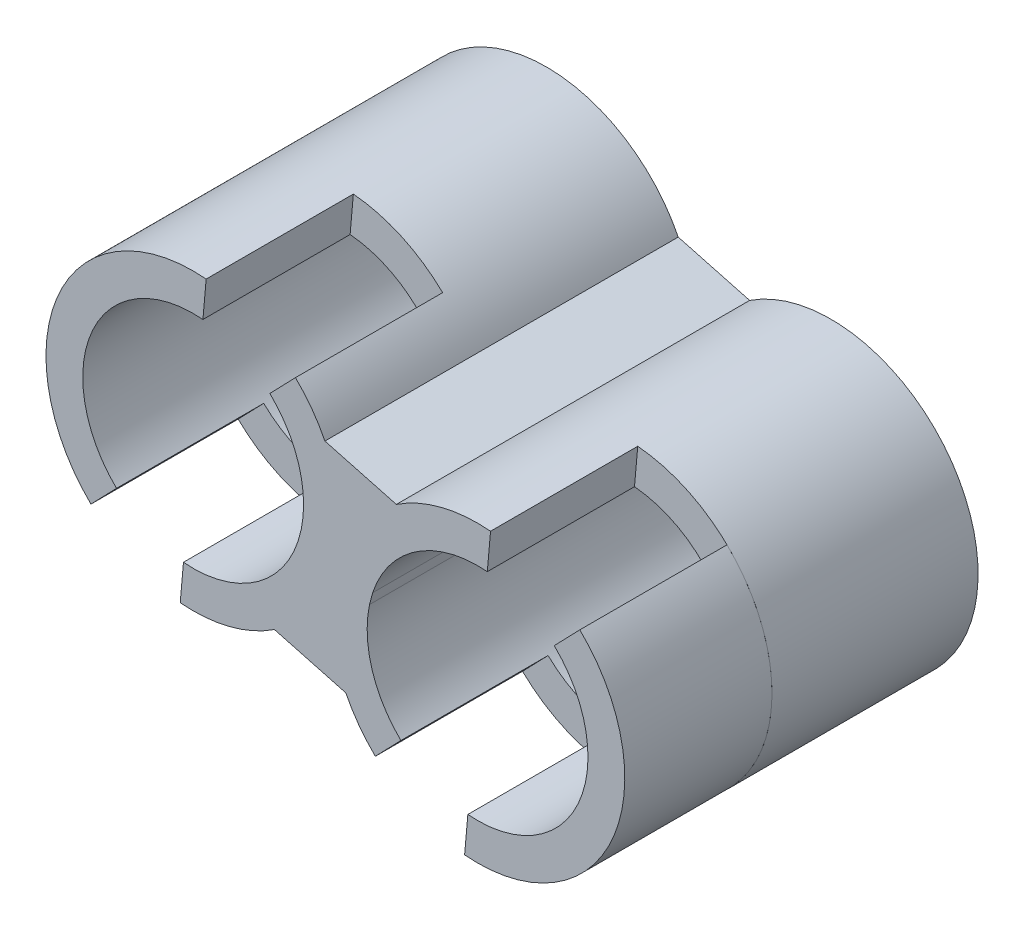
ISO-10303-21;
HEADER;
FILE_DESCRIPTION(('STEP AP214'),'2;1');
FILE_NAME('part.step','',(''),(''),'','','');
FILE_SCHEMA(('AUTOMOTIVE_DESIGN { 1 0 10303 214 1 1 1 1 }'));
ENDSEC;
DATA;
#1=APPLICATION_CONTEXT('core data for automotive mechanical design processes');
#2=APPLICATION_PROTOCOL_DEFINITION('international standard','automotive_design',2000,#1);
#3=PRODUCT_CONTEXT('',#1,'mechanical');
#4=PRODUCT('Part','Part','',(#3));
#5=PRODUCT_RELATED_PRODUCT_CATEGORY('part','',(#4));
#6=PRODUCT_DEFINITION_FORMATION('','',#4);
#7=PRODUCT_DEFINITION_CONTEXT('part definition',#1,'design');
#8=PRODUCT_DEFINITION('design','',#6,#7);
#9=PRODUCT_DEFINITION_SHAPE('','',#8);
#10=(LENGTH_UNIT() NAMED_UNIT(*) SI_UNIT(.MILLI.,.METRE.));
#11=(NAMED_UNIT(*) PLANE_ANGLE_UNIT() SI_UNIT($,.RADIAN.));
#12=(NAMED_UNIT(*) SI_UNIT($,.STERADIAN.) SOLID_ANGLE_UNIT());
#13=UNCERTAINTY_MEASURE_WITH_UNIT(LENGTH_MEASURE(1.E-05),#10,'distance_accuracy_value','');
#14=(GEOMETRIC_REPRESENTATION_CONTEXT(3) GLOBAL_UNCERTAINTY_ASSIGNED_CONTEXT((#13)) GLOBAL_UNIT_ASSIGNED_CONTEXT((#10,
#11,#12)) REPRESENTATION_CONTEXT('',''));
#15=CARTESIAN_POINT('',(0.,0.,0.));
#16=DIRECTION('',(0.,0.,1.));
#17=DIRECTION('',(1.,0.,0.));
#18=AXIS2_PLACEMENT_3D('',#15,#16,#17);
#19=CARTESIAN_POINT('',(19.3185165257814,-5.17638090205016,24.));
#20=DIRECTION('',(0.,0.,-1.));
#21=DIRECTION('',(-1.,0.,0.));
#22=AXIS2_PLACEMENT_3D('',#19,#20,#21);
#23=CYLINDRICAL_SURFACE('',#22,7.5);
#24=CARTESIAN_POINT('',(19.3185165257814,-5.17638090205016,14.));
#25=DIRECTION('',(0.,0.,1.));
#26=DIRECTION('',(1.,0.,0.));
#27=AXIS2_PLACEMENT_3D('',#24,#25,#26);
#28=CIRCLE('',#27,7.5);
#29=CARTESIAN_POINT('',(18.6579738156018,-12.6472364974976,14.));
#30=VERTEX_POINT('',#29);
#31=CARTESIAN_POINT('',(24.5279987695268,0.219107468069976,14.));
#32=VERTEX_POINT('',#31);
#33=EDGE_CURVE('E186',#30,#32,#28,.T.);
#34=ORIENTED_EDGE('',*,*,#33,.F.);
#35=DIRECTION('',(0.,0.,-1.));
#36=VECTOR('',#35,1.);
#37=CARTESIAN_POINT('',(18.6579738156018,-12.6472364974976,24.));
#38=LINE('',#37,#36);
#39=CARTESIAN_POINT('',(18.6579738156018,-12.6472364974976,24.));
#40=VERTEX_POINT('',#39);
#41=EDGE_CURVE('E13',#40,#30,#38,.T.);
#42=ORIENTED_EDGE('',*,*,#41,.F.);
#43=CARTESIAN_POINT('',(19.3185165257814,-5.17638090205016,24.));
#44=DIRECTION('',(0.,0.,1.));
#45=DIRECTION('',(1.,0.,0.));
#46=AXIS2_PLACEMENT_3D('',#43,#44,#45);
#47=CIRCLE('',#46,7.5);
#48=CARTESIAN_POINT('',(24.5279987695268,0.219107468069976,24.));
#49=VERTEX_POINT('',#48);
#50=EDGE_CURVE('E171',#40,#49,#47,.T.);
#51=ORIENTED_EDGE('',*,*,#50,.T.);
#52=DIRECTION('',(0.,0.,-1.));
#53=VECTOR('',#52,1.);
#54=CARTESIAN_POINT('',(24.5279987695268,0.219107468069976,24.));
#55=LINE('',#54,#53);
#56=EDGE_CURVE('E139',#49,#32,#55,.T.);
#57=ORIENTED_EDGE('',*,*,#56,.T.);
#58=EDGE_LOOP('',(#34,#42,#51,#57));
#59=FACE_BOUND('',#58,.T.);
#60=ADVANCED_FACE('F123',(#59),#23,.F.);
#61=CARTESIAN_POINT('',(19.6227923130935,-1.73496760179407,24.));
#62=DIRECTION('',(0.996114079392994,-0.0880723613572872,0.));
#63=DIRECTION('',(0.0880723613572872,0.996114079392994,0.));
#64=AXIS2_PLACEMENT_3D('',#61,#62,#63);
#65=PLANE('',#64);
#66=DIRECTION('',(-0.0880723613572873,-0.996114079392994,0.));
#67=VECTOR('',#66,1.);
#68=CARTESIAN_POINT('',(19.6227923130935,-1.73496760179407,14.));
#69=LINE('',#68,#67);
#70=CARTESIAN_POINT('',(18.4377929122086,-15.1375216959801,14.));
#71=VERTEX_POINT('',#70);
#72=EDGE_CURVE('E177',#30,#71,#69,.T.);
#73=ORIENTED_EDGE('',*,*,#72,.T.);
#74=DIRECTION('',(0.,0.,-1.));
#75=VECTOR('',#74,1.);
#76=CARTESIAN_POINT('',(18.4377929122086,-15.1375216959801,24.));
#77=LINE('',#76,#75);
#78=CARTESIAN_POINT('',(18.4377929122086,-15.1375216959801,24.));
#79=VERTEX_POINT('',#78);
#80=EDGE_CURVE('E131',#79,#71,#77,.T.);
#81=ORIENTED_EDGE('',*,*,#80,.F.);
#82=DIRECTION('',(-0.0880723613572873,-0.996114079392994,0.));
#83=VECTOR('',#82,1.);
#84=CARTESIAN_POINT('',(19.6227923130935,-1.73496760179407,24.));
#85=LINE('',#84,#83);
#86=EDGE_CURVE('E165',#40,#79,#85,.T.);
#87=ORIENTED_EDGE('',*,*,#86,.F.);
#88=ORIENTED_EDGE('',*,*,#41,.T.);
#89=EDGE_LOOP('',(#73,#81,#87,#88));
#90=FACE_BOUND('',#89,.T.);
#91=ADVANCED_FACE('F175',(#90),#65,.F.);
#92=CARTESIAN_POINT('',(19.3185165257814,-5.17638090205016,24.));
#93=DIRECTION('',(0.,0.,-1.));
#94=DIRECTION('',(-1.,0.,0.));
#95=AXIS2_PLACEMENT_3D('',#92,#93,#94);
#96=CYLINDRICAL_SURFACE('',#95,10.);
#97=CARTESIAN_POINT('',(19.3185165257814,-5.17638090205016,14.));
#98=DIRECTION('',(0.,0.,1.));
#99=DIRECTION('',(1.,0.,0.));
#100=AXIS2_PLACEMENT_3D('',#97,#98,#99);
#101=CIRCLE('',#100,10.);
#102=CARTESIAN_POINT('',(26.2644928507753,2.01760359144336,14.));
#103=VERTEX_POINT('',#102);
#104=EDGE_CURVE('E189',#71,#103,#101,.T.);
#105=ORIENTED_EDGE('',*,*,#104,.T.);
#106=DIRECTION('',(0.,0.,-1.));
#107=VECTOR('',#106,1.);
#108=CARTESIAN_POINT('',(26.2644928507753,2.01760359144336,24.));
#109=LINE('',#108,#107);
#110=CARTESIAN_POINT('',(26.2644928507753,2.01760359144336,24.));
#111=VERTEX_POINT('',#110);
#112=EDGE_CURVE('E153',#111,#103,#109,.T.);
#113=ORIENTED_EDGE('',*,*,#112,.F.);
#114=CARTESIAN_POINT('',(19.3185165257814,-5.17638090205016,24.));
#115=DIRECTION('',(0.,0.,1.));
#116=DIRECTION('',(1.,0.,0.));
#117=AXIS2_PLACEMENT_3D('',#114,#115,#116);
#118=CIRCLE('',#117,10.);
#119=EDGE_CURVE('E170',#79,#111,#118,.T.);
#120=ORIENTED_EDGE('',*,*,#119,.F.);
#121=ORIENTED_EDGE('',*,*,#80,.T.);
#122=EDGE_LOOP('',(#105,#113,#120,#121));
#123=FACE_BOUND('',#122,.T.);
#124=ADVANCED_FACE('F180',(#123),#96,.T.);
#125=CARTESIAN_POINT('',(12.5845901278236,-12.1507441622472,24.));
#126=DIRECTION('',(-0.719398449349352,0.694597632499383,0.));
#127=DIRECTION('',(-0.694597632499383,-0.719398449349352,0.));
#128=AXIS2_PLACEMENT_3D('',#125,#126,#127);
#129=PLANE('',#128);
#130=DIRECTION('',(0.694597632499383,0.719398449349352,0.));
#131=VECTOR('',#130,1.);
#132=CARTESIAN_POINT('',(12.5845901278236,-12.1507441622472,14.));
#133=LINE('',#132,#131);
#134=EDGE_CURVE('E191',#32,#103,#133,.T.);
#135=ORIENTED_EDGE('',*,*,#134,.F.);
#136=ORIENTED_EDGE('',*,*,#56,.F.);
#137=DIRECTION('',(0.694597632499383,0.719398449349352,0.));
#138=VECTOR('',#137,1.);
#139=CARTESIAN_POINT('',(12.5845901278236,-12.1507441622472,24.));
#140=LINE('',#139,#138);
#141=EDGE_CURVE('E181',#49,#111,#140,.T.);
#142=ORIENTED_EDGE('',*,*,#141,.T.);
#143=ORIENTED_EDGE('',*,*,#112,.T.);
#144=EDGE_LOOP('',(#135,#136,#142,#143));
#145=FACE_BOUND('',#144,.T.);
#146=ADVANCED_FACE('F196',(#145),#129,.T.);
#147=CARTESIAN_POINT('',(0.,0.,24.));
#148=DIRECTION('',(0.,0.,1.));
#149=DIRECTION('',(1.,0.,0.));
#150=AXIS2_PLACEMENT_3D('',#147,#148,#149);
#151=PLANE('',#150);
#152=ORIENTED_EDGE('',*,*,#50,.F.);
#153=ORIENTED_EDGE('',*,*,#86,.T.);
#154=ORIENTED_EDGE('',*,*,#119,.T.);
#155=ORIENTED_EDGE('',*,*,#141,.F.);
#156=EDGE_LOOP('',(#152,#153,#154,#155));
#157=FACE_BOUND('',#156,.T.);
#158=ADVANCED_FACE('F167',(#157),#151,.T.);
#159=CARTESIAN_POINT('',(0.,0.,14.));
#160=DIRECTION('',(0.,0.,1.));
#161=DIRECTION('',(1.,0.,0.));
#162=AXIS2_PLACEMENT_3D('',#159,#160,#161);
#163=PLANE('',#162);
#164=ORIENTED_EDGE('',*,*,#33,.T.);
#165=ORIENTED_EDGE('',*,*,#134,.T.);
#166=ORIENTED_EDGE('',*,*,#104,.F.);
#167=ORIENTED_EDGE('',*,*,#72,.F.);
#168=EDGE_LOOP('',(#164,#165,#166,#167));
#169=FACE_BOUND('',#168,.T.);
#170=ADVANCED_FACE('F203',(#169),#163,.F.);
#171=CLOSED_SHELL('',(#60,#91,#124,#146,#158,#170));
#172=MANIFOLD_SOLID_BREP('B2',#171);
#173=CARTESIAN_POINT('',(0.,0.,14.));
#174=DIRECTION('',(0.,0.,1.));
#175=DIRECTION('',(1.,0.,0.));
#176=AXIS2_PLACEMENT_3D('',#173,#174,#175);
#177=PLANE('',#176);
#178=CARTESIAN_POINT('',(19.3185165257814,-5.17638090205016,14.));
#179=DIRECTION('',(0.,0.,1.));
#180=DIRECTION('',(1.,0.,0.));
#181=AXIS2_PLACEMENT_3D('',#178,#179,#180);
#182=CIRCLE('',#181,10.);
#183=CARTESIAN_POINT('',(12.3725402007876,-12.3703653955437,14.));
#184=VERTEX_POINT('',#183);
#185=CARTESIAN_POINT('',(20.1992401393543,4.78475989187978,14.));
#186=VERTEX_POINT('',#185);
#187=EDGE_CURVE('E435',#184,#186,#182,.T.);
#188=ORIENTED_EDGE('',*,*,#187,.T.);
#189=DIRECTION('',(0.0880723613572873,0.996114079392994,0.));
#190=VECTOR('',#189,1.);
#191=CARTESIAN_POINT('',(19.6227923130935,-1.73496760179407,14.));
#192=LINE('',#191,#190);
#193=CARTESIAN_POINT('',(19.9790592359611,2.2944746933973,14.));
#194=VERTEX_POINT('',#193);
#195=EDGE_CURVE('E269',#194,#186,#192,.T.);
#196=ORIENTED_EDGE('',*,*,#195,.F.);
#197=CARTESIAN_POINT('',(19.3185165257814,-5.17638090205016,14.));
#198=DIRECTION('',(0.,0.,1.));
#199=DIRECTION('',(1.,0.,0.));
#200=AXIS2_PLACEMENT_3D('',#197,#198,#199);
#201=CIRCLE('',#200,7.5);
#202=CARTESIAN_POINT('',(14.1090342820361,-10.5718692721703,14.));
#203=VERTEX_POINT('',#202);
#204=EDGE_CURVE('E390',#203,#194,#201,.T.);
#205=ORIENTED_EDGE('',*,*,#204,.F.);
#206=DIRECTION('',(0.694597632499384,0.719398449349351,0.));
#207=VECTOR('',#206,1.);
#208=CARTESIAN_POINT('',(12.5845901278235,-12.1507441622472,14.));
#209=LINE('',#208,#207);
#210=EDGE_CURVE('E410',#184,#203,#209,.T.);
#211=ORIENTED_EDGE('',*,*,#210,.F.);
#212=EDGE_LOOP('',(#188,#196,#205,#211));
#213=FACE_BOUND('',#212,.T.);
#214=ADVANCED_FACE('F247',(#213),#177,.T.);
#215=CARTESIAN_POINT('',(0.,0.,14.));
#216=DIRECTION('',(0.,0.,1.));
#217=DIRECTION('',(1.,0.,0.));
#218=AXIS2_PLACEMENT_3D('',#215,#216,#217);
#219=PLANE('',#218);
#220=CARTESIAN_POINT('',(0.,0.,14.));
#221=DIRECTION('',(0.,0.,1.));
#222=DIRECTION('',(1.,0.,0.));
#223=AXIS2_PLACEMENT_3D('',#220,#221,#222);
#224=CIRCLE('',#223,10.);
#225=CARTESIAN_POINT('',(-6.94597632499384,-7.19398449349351,14.));
#226=VERTEX_POINT('',#225);
#227=CARTESIAN_POINT('',(-0.880723613572865,-9.96114079392994,14.));
#228=VERTEX_POINT('',#227);
#229=EDGE_CURVE('E517',#226,#228,#224,.T.);
#230=ORIENTED_EDGE('',*,*,#229,.T.);
#231=DIRECTION('',(-0.0880723613572865,-0.996114079392994,0.));
#232=VECTOR('',#231,1.);
#233=CARTESIAN_POINT('',(0.,0.,14.));
#234=LINE('',#233,#232);
#235=CARTESIAN_POINT('',(-0.660542710179649,-7.47085559544745,14.));
#236=VERTEX_POINT('',#235);
#237=EDGE_CURVE('E467',#236,#228,#234,.T.);
#238=ORIENTED_EDGE('',*,*,#237,.F.);
#239=CARTESIAN_POINT('',(0.,0.,14.));
#240=DIRECTION('',(0.,0.,1.));
#241=DIRECTION('',(1.,0.,0.));
#242=AXIS2_PLACEMENT_3D('',#239,#240,#241);
#243=CIRCLE('',#242,7.5);
#244=CARTESIAN_POINT('',(-5.20948224374538,-5.39548837012014,14.));
#245=VERTEX_POINT('',#244);
#246=EDGE_CURVE('E543',#245,#236,#243,.T.);
#247=ORIENTED_EDGE('',*,*,#246,.F.);
#248=DIRECTION('',(0.694597632499383,0.719398449349351,0.));
#249=VECTOR('',#248,1.);
#250=CARTESIAN_POINT('',(0.,0.,14.));
#251=LINE('',#250,#249);
#252=EDGE_CURVE('E502',#226,#245,#251,.T.);
#253=ORIENTED_EDGE('',*,*,#252,.F.);
#254=EDGE_LOOP('',(#230,#238,#247,#253));
#255=FACE_BOUND('',#254,.T.);
#256=ADVANCED_FACE('F592',(#255),#219,.T.);
#257=CARTESIAN_POINT('',(0.,0.,2.));
#258=DIRECTION('',(0.,0.,-1.));
#259=DIRECTION('',(-1.,0.,0.));
#260=AXIS2_PLACEMENT_3D('',#257,#258,#259);
#261=CYLINDRICAL_SURFACE('',#260,3.285);
#262=CARTESIAN_POINT('',(0.,0.,2.));
#263=DIRECTION('',(0.,0.,1.));
#264=DIRECTION('',(1.,0.,0.));
#265=AXIS2_PLACEMENT_3D('',#262,#263,#264);
#266=CIRCLE('',#265,3.285);
#267=CARTESIAN_POINT('',(3.285,0.,2.));
#268=VERTEX_POINT('',#267);
#269=EDGE_CURVE('E557',#268,#268,#266,.T.);
#270=ORIENTED_EDGE('',*,*,#269,.T.);
#271=EDGE_LOOP('',(#270));
#272=FACE_BOUND('',#271,.T.);
#273=CARTESIAN_POINT('',(0.,0.,0.));
#274=DIRECTION('',(0.,0.,1.));
#275=DIRECTION('',(1.,0.,0.));
#276=AXIS2_PLACEMENT_3D('',#273,#274,#275);
#277=CIRCLE('',#276,3.285);
#278=CARTESIAN_POINT('',(3.285,0.,0.));
#279=VERTEX_POINT('',#278);
#280=EDGE_CURVE('E553',#279,#279,#277,.T.);
#281=ORIENTED_EDGE('',*,*,#280,.F.);
#282=EDGE_LOOP('',(#281));
#283=FACE_BOUND('',#282,.T.);
#284=ADVANCED_FACE('F249',(#272,#283),#261,.F.);
#285=CARTESIAN_POINT('',(0.,0.,2.));
#286=DIRECTION('',(0.,0.,1.));
#287=DIRECTION('',(1.,0.,0.));
#288=AXIS2_PLACEMENT_3D('',#285,#286,#287);
#289=PLANE('',#288);
#290=DIRECTION('',(-0.258819045102508,-0.965925826289072,0.));
#291=VECTOR('',#290,1.);
#292=CARTESIAN_POINT('',(7.23315714966661,-1.93811861698047,2.));
#293=LINE('',#292,#291);
#294=CARTESIAN_POINT('',(7.34147033019424,-1.53388832412197,2.));
#295=VERTEX_POINT('',#294);
#296=CARTESIAN_POINT('',(7.124843969139,-2.34234890983894,2.));
#297=VERTEX_POINT('',#296);
#298=EDGE_CURVE('E463',#295,#297,#293,.T.);
#299=ORIENTED_EDGE('',*,*,#298,.F.);
#300=CARTESIAN_POINT('',(0.,0.,2.));
#301=DIRECTION('',(0.,0.,1.));
#302=DIRECTION('',(1.,0.,0.));
#303=AXIS2_PLACEMENT_3D('',#300,#301,#302);
#304=CIRCLE('',#303,7.5);
#305=EDGE_CURVE('E558',#297,#295,#304,.F.);
#306=ORIENTED_EDGE('',*,*,#305,.F.);
#307=EDGE_LOOP('',(#299,#306));
#308=FACE_BOUND('',#307,.T.);
#309=ORIENTED_EDGE('',*,*,#269,.F.);
#310=EDGE_LOOP('',(#309));
#311=FACE_BOUND('',#310,.T.);
#312=ADVANCED_FACE('F607',(#308,#311),#289,.T.);
#313=CARTESIAN_POINT('',(0.,0.,0.));
#314=DIRECTION('',(0.,0.,1.));
#315=DIRECTION('',(1.,0.,0.));
#316=AXIS2_PLACEMENT_3D('',#313,#314,#315);
#317=PLANE('',#316);
#318=ORIENTED_EDGE('',*,*,#280,.T.);
#319=EDGE_LOOP('',(#318));
#320=FACE_BOUND('',#319,.T.);
#321=DIRECTION('',(-0.965925826289072,0.258819045102508,0.));
#322=VECTOR('',#321,1.);
#323=CARTESIAN_POINT('',(13.8007094970205,3.16351151892005,0.));
#324=LINE('',#323,#322);
#325=CARTESIAN_POINT('',(13.8007094970205,3.16351151892005,0.));
#326=VERTEX_POINT('',#325);
#327=CARTESIAN_POINT('',(8.94850727057229,4.46365518700927,0.));
#328=VERTEX_POINT('',#327);
#329=EDGE_CURVE('E439',#326,#328,#324,.T.);
#330=ORIENTED_EDGE('',*,*,#329,.F.);
#331=CARTESIAN_POINT('',(19.3185165257814,-5.17638090205016,0.));
#332=DIRECTION('',(0.,0.,1.));
#333=DIRECTION('',(1.,0.,0.));
#334=AXIS2_PLACEMENT_3D('',#331,#332,#333);
#335=CIRCLE('',#334,10.);
#336=CARTESIAN_POINT('',(10.3700092552091,-9.64003608905943,0.));
#337=VERTEX_POINT('',#336);
#338=EDGE_CURVE('E433',#337,#326,#335,.T.);
#339=ORIENTED_EDGE('',*,*,#338,.F.);
#340=DIRECTION('',(0.965925826289072,-0.258819045102508,0.));
#341=VECTOR('',#340,1.);
#342=CARTESIAN_POINT('',(5.51780702876094,-8.33989242097021,0.));
#343=LINE('',#342,#341);
#344=CARTESIAN_POINT('',(5.51780702876094,-8.33989242097021,0.));
#345=VERTEX_POINT('',#344);
#346=EDGE_CURVE('E441',#345,#337,#343,.T.);
#347=ORIENTED_EDGE('',*,*,#346,.F.);
#348=CARTESIAN_POINT('',(0.,0.,0.));
#349=DIRECTION('',(0.,0.,1.));
#350=DIRECTION('',(1.,0.,0.));
#351=AXIS2_PLACEMENT_3D('',#348,#349,#350);
#352=CIRCLE('',#351,10.);
#353=EDGE_CURVE('E528',#328,#345,#352,.T.);
#354=ORIENTED_EDGE('',*,*,#353,.F.);
#355=EDGE_LOOP('',(#330,#339,#347,#354));
#356=FACE_BOUND('',#355,.T.);
#357=CARTESIAN_POINT('',(19.3185165257814,-5.17638090205016,0.));
#358=DIRECTION('',(0.,0.,1.));
#359=DIRECTION('',(1.,0.,0.));
#360=AXIS2_PLACEMENT_3D('',#357,#358,#359);
#361=CIRCLE('',#360,3.285);
#362=CARTESIAN_POINT('',(22.6035165257814,-5.17638090205016,0.));
#363=VERTEX_POINT('',#362);
#364=EDGE_CURVE('E392',#363,#363,#361,.T.);
#365=ORIENTED_EDGE('',*,*,#364,.T.);
#366=EDGE_LOOP('',(#365));
#367=FACE_BOUND('',#366,.T.);
#368=ADVANCED_FACE('F617',(#320,#356,#367),#317,.F.);
#369=CARTESIAN_POINT('',(0.,0.,14.));
#370=DIRECTION('',(0.,0.,-1.));
#371=DIRECTION('',(-1.,0.,0.));
#372=AXIS2_PLACEMENT_3D('',#369,#370,#371);
#373=CYLINDRICAL_SURFACE('',#372,7.5);
#374=DIRECTION('',(0.,0.,-1.));
#375=VECTOR('',#374,1.);
#376=CARTESIAN_POINT('',(7.34147033019423,-1.533888324122,14.));
#377=LINE('',#376,#375);
#378=CARTESIAN_POINT('',(7.34147033019424,-1.53388832412197,24.));
#379=VERTEX_POINT('',#378);
#380=EDGE_CURVE('E465',#379,#295,#377,.T.);
#381=ORIENTED_EDGE('',*,*,#380,.F.);
#382=CARTESIAN_POINT('',(0.,0.,24.));
#383=DIRECTION('',(0.,0.,1.));
#384=DIRECTION('',(1.,0.,0.));
#385=AXIS2_PLACEMENT_3D('',#382,#383,#384);
#386=CIRCLE('',#385,7.5);
#387=CARTESIAN_POINT('',(5.20948224374538,5.39548837012013,24.));
#388=VERTEX_POINT('',#387);
#389=EDGE_CURVE('E468',#388,#379,#386,.F.);
#390=ORIENTED_EDGE('',*,*,#389,.F.);
#391=DIRECTION('',(0.,0.,-1.));
#392=VECTOR('',#391,1.);
#393=CARTESIAN_POINT('',(5.20948224374538,5.39548837012013,24.));
#394=LINE('',#393,#392);
#395=CARTESIAN_POINT('',(5.20948224374538,5.39548837012013,14.));
#396=VERTEX_POINT('',#395);
#397=EDGE_CURVE('E481',#388,#396,#394,.T.);
#398=ORIENTED_EDGE('',*,*,#397,.T.);
#399=CARTESIAN_POINT('',(0.660542710179649,7.47085559544745,14.));
#400=VERTEX_POINT('',#399);
#401=EDGE_CURVE('E544',#396,#400,#243,.T.);
#402=ORIENTED_EDGE('',*,*,#401,.T.);
#403=DIRECTION('',(0.,0.,-1.));
#404=VECTOR('',#403,1.);
#405=CARTESIAN_POINT('',(0.660542710179649,7.47085559544745,24.));
#406=LINE('',#405,#404);
#407=CARTESIAN_POINT('',(0.660542710179649,7.47085559544745,24.));
#408=VERTEX_POINT('',#407);
#409=EDGE_CURVE('E522',#408,#400,#406,.T.);
#410=ORIENTED_EDGE('',*,*,#409,.F.);
#411=CARTESIAN_POINT('',(0.,0.,24.));
#412=DIRECTION('',(0.,0.,1.));
#413=DIRECTION('',(1.,0.,0.));
#414=AXIS2_PLACEMENT_3D('',#411,#412,#413);
#415=CIRCLE('',#414,7.5);
#416=CARTESIAN_POINT('',(-5.20948224374538,-5.39548837012014,24.));
#417=VERTEX_POINT('',#416);
#418=EDGE_CURVE('E498',#417,#408,#415,.F.);
#419=ORIENTED_EDGE('',*,*,#418,.F.);
#420=DIRECTION('',(0.,0.,-1.));
#421=VECTOR('',#420,1.);
#422=CARTESIAN_POINT('',(-5.20948224374538,-5.39548837012014,24.));
#423=LINE('',#422,#421);
#424=EDGE_CURVE('E508',#417,#245,#423,.T.);
#425=ORIENTED_EDGE('',*,*,#424,.T.);
#426=ORIENTED_EDGE('',*,*,#246,.T.);
#427=DIRECTION('',(0.,0.,-1.));
#428=VECTOR('',#427,1.);
#429=CARTESIAN_POINT('',(-0.660542710179649,-7.47085559544745,24.));
#430=LINE('',#429,#428);
#431=CARTESIAN_POINT('',(-0.660542710179649,-7.47085559544745,24.));
#432=VERTEX_POINT('',#431);
#433=EDGE_CURVE('E494',#432,#236,#430,.T.);
#434=ORIENTED_EDGE('',*,*,#433,.F.);
#435=CARTESIAN_POINT('',(7.12484396913899,-2.34234890983897,24.));
#436=VERTEX_POINT('',#435);
#437=EDGE_CURVE('E472',#436,#432,#386,.F.);
#438=ORIENTED_EDGE('',*,*,#437,.F.);
#439=DIRECTION('',(0.,0.,-1.));
#440=VECTOR('',#439,1.);
#441=CARTESIAN_POINT('',(7.124843969139,-2.34234890983894,14.));
#442=LINE('',#441,#440);
#443=EDGE_CURVE('E453',#297,#436,#442,.F.);
#444=ORIENTED_EDGE('',*,*,#443,.F.);
#445=ORIENTED_EDGE('',*,*,#305,.T.);
#446=EDGE_LOOP('',(#381,#390,#398,#402,#410,#419,#425,#426,#434,#438,#444,#445));
#447=FACE_BOUND('',#446,.T.);
#448=ADVANCED_FACE('F571',(#447),#373,.F.);
#449=CARTESIAN_POINT('',(0.,0.,14.));
#450=DIRECTION('',(0.,0.,-1.));
#451=DIRECTION('',(-1.,0.,0.));
#452=AXIS2_PLACEMENT_3D('',#449,#450,#451);
#453=CYLINDRICAL_SURFACE('',#452,10.);
#454=ORIENTED_EDGE('',*,*,#353,.T.);
#455=DIRECTION('',(0.,0.,1.));
#456=VECTOR('',#455,1.);
#457=CARTESIAN_POINT('',(5.51780702876094,-8.33989242097021,0.));
#458=LINE('',#457,#456);
#459=CARTESIAN_POINT('',(5.51780702876094,-8.33989242097021,24.));
#460=VERTEX_POINT('',#459);
#461=EDGE_CURVE('E454',#345,#460,#458,.T.);
#462=ORIENTED_EDGE('',*,*,#461,.T.);
#463=CARTESIAN_POINT('',(0.,0.,24.));
#464=DIRECTION('',(0.,0.,1.));
#465=DIRECTION('',(1.,0.,0.));
#466=AXIS2_PLACEMENT_3D('',#463,#464,#465);
#467=CIRCLE('',#466,10.);
#468=CARTESIAN_POINT('',(-0.880723613572865,-9.96114079392994,24.));
#469=VERTEX_POINT('',#468);
#470=EDGE_CURVE('E475',#469,#460,#467,.T.);
#471=ORIENTED_EDGE('',*,*,#470,.F.);
#472=DIRECTION('',(0.,0.,-1.));
#473=VECTOR('',#472,1.);
#474=CARTESIAN_POINT('',(-0.880723613572865,-9.96114079392994,24.));
#475=LINE('',#474,#473);
#476=EDGE_CURVE('E491',#469,#228,#475,.T.);
#477=ORIENTED_EDGE('',*,*,#476,.T.);
#478=ORIENTED_EDGE('',*,*,#229,.F.);
#479=DIRECTION('',(0.,0.,-1.));
#480=VECTOR('',#479,1.);
#481=CARTESIAN_POINT('',(-6.94597632499384,-7.19398449349351,24.));
#482=LINE('',#481,#480);
#483=CARTESIAN_POINT('',(-6.94597632499384,-7.19398449349351,24.));
#484=VERTEX_POINT('',#483);
#485=EDGE_CURVE('E523',#484,#226,#482,.T.);
#486=ORIENTED_EDGE('',*,*,#485,.F.);
#487=CARTESIAN_POINT('',(0.,0.,24.));
#488=DIRECTION('',(0.,0.,1.));
#489=DIRECTION('',(1.,0.,0.));
#490=AXIS2_PLACEMENT_3D('',#487,#488,#489);
#491=CIRCLE('',#490,10.);
#492=CARTESIAN_POINT('',(0.880723613572866,9.96114079392994,24.));
#493=VERTEX_POINT('',#492);
#494=EDGE_CURVE('E504',#493,#484,#491,.T.);
#495=ORIENTED_EDGE('',*,*,#494,.F.);
#496=DIRECTION('',(0.,0.,-1.));
#497=VECTOR('',#496,1.);
#498=CARTESIAN_POINT('',(0.880723613572866,9.96114079392994,24.));
#499=LINE('',#498,#497);
#500=CARTESIAN_POINT('',(0.880723613572866,9.96114079392994,14.));
#501=VERTEX_POINT('',#500);
#502=EDGE_CURVE('E519',#493,#501,#499,.T.);
#503=ORIENTED_EDGE('',*,*,#502,.T.);
#504=CARTESIAN_POINT('',(6.94597632499384,7.19398449349351,14.));
#505=VERTEX_POINT('',#504);
#506=EDGE_CURVE('E541',#505,#501,#224,.T.);
#507=ORIENTED_EDGE('',*,*,#506,.F.);
#508=DIRECTION('',(0.,0.,-1.));
#509=VECTOR('',#508,1.);
#510=CARTESIAN_POINT('',(6.94597632499384,7.19398449349351,24.));
#511=LINE('',#510,#509);
#512=CARTESIAN_POINT('',(6.94597632499384,7.19398449349351,24.));
#513=VERTEX_POINT('',#512);
#514=EDGE_CURVE('E488',#513,#505,#511,.T.);
#515=ORIENTED_EDGE('',*,*,#514,.F.);
#516=CARTESIAN_POINT('',(8.9485072705723,4.46365518700927,24.));
#517=VERTEX_POINT('',#516);
#518=EDGE_CURVE('E474',#517,#513,#467,.T.);
#519=ORIENTED_EDGE('',*,*,#518,.F.);
#520=DIRECTION('',(0.,0.,1.));
#521=VECTOR('',#520,1.);
#522=CARTESIAN_POINT('',(8.94850727057229,4.46365518700927,0.));
#523=LINE('',#522,#521);
#524=EDGE_CURVE('E457',#328,#517,#523,.T.);
#525=ORIENTED_EDGE('',*,*,#524,.F.);
#526=EDGE_LOOP('',(#454,#462,#471,#477,#478,#486,#495,#503,#507,#515,#519,#525));
#527=FACE_BOUND('',#526,.T.);
#528=ADVANCED_FACE('F593',(#527),#453,.T.);
#529=DIRECTION('',(0.694597632499383,0.719398449349351,0.));
#530=VECTOR('',#529,1.);
#531=CARTESIAN_POINT('',(0.,0.,14.));
#532=LINE('',#531,#530);
#533=EDGE_CURVE('E484',#396,#505,#532,.T.);
#534=ORIENTED_EDGE('',*,*,#533,.T.);
#535=ORIENTED_EDGE('',*,*,#506,.T.);
#536=DIRECTION('',(0.0880723613572865,0.996114079392994,0.));
#537=VECTOR('',#536,1.);
#538=CARTESIAN_POINT('',(0.,0.,14.));
#539=LINE('',#538,#537);
#540=EDGE_CURVE('E497',#400,#501,#539,.T.);
#541=ORIENTED_EDGE('',*,*,#540,.F.);
#542=ORIENTED_EDGE('',*,*,#401,.F.);
#543=EDGE_LOOP('',(#534,#535,#541,#542));
#544=FACE_BOUND('',#543,.T.);
#545=ADVANCED_FACE('F576',(#544),#219,.T.);
#546=CARTESIAN_POINT('',(0.,0.,24.));
#547=DIRECTION('',(-0.996114079392994,0.0880723613572865,0.));
#548=DIRECTION('',(-0.0880723613572865,-0.996114079392994,0.));
#549=AXIS2_PLACEMENT_3D('',#546,#547,#548);
#550=PLANE('',#549);
#551=ORIENTED_EDGE('',*,*,#540,.T.);
#552=ORIENTED_EDGE('',*,*,#502,.F.);
#553=DIRECTION('',(0.0880723613572865,0.996114079392994,0.));
#554=VECTOR('',#553,1.);
#555=CARTESIAN_POINT('',(0.,0.,24.));
#556=LINE('',#555,#554);
#557=EDGE_CURVE('E501',#408,#493,#556,.T.);
#558=ORIENTED_EDGE('',*,*,#557,.F.);
#559=ORIENTED_EDGE('',*,*,#409,.T.);
#560=EDGE_LOOP('',(#551,#552,#558,#559));
#561=FACE_BOUND('',#560,.T.);
#562=ADVANCED_FACE('F580',(#561),#550,.F.);
#563=CARTESIAN_POINT('',(0.,0.,24.));
#564=DIRECTION('',(-0.719398449349351,0.694597632499383,0.));
#565=DIRECTION('',(-0.694597632499383,-0.719398449349351,0.));
#566=AXIS2_PLACEMENT_3D('',#563,#564,#565);
#567=PLANE('',#566);
#568=ORIENTED_EDGE('',*,*,#252,.T.);
#569=ORIENTED_EDGE('',*,*,#424,.F.);
#570=DIRECTION('',(0.694597632499383,0.719398449349351,0.));
#571=VECTOR('',#570,1.);
#572=CARTESIAN_POINT('',(0.,0.,24.));
#573=LINE('',#572,#571);
#574=EDGE_CURVE('E506',#484,#417,#573,.T.);
#575=ORIENTED_EDGE('',*,*,#574,.F.);
#576=ORIENTED_EDGE('',*,*,#485,.T.);
#577=EDGE_LOOP('',(#568,#569,#575,#576));
#578=FACE_BOUND('',#577,.T.);
#579=ADVANCED_FACE('F588',(#578),#567,.F.);
#580=CARTESIAN_POINT('',(0.,0.,24.));
#581=DIRECTION('',(0.,0.,1.));
#582=DIRECTION('',(1.,0.,0.));
#583=AXIS2_PLACEMENT_3D('',#580,#581,#582);
#584=PLANE('',#583);
#585=ORIENTED_EDGE('',*,*,#418,.T.);
#586=ORIENTED_EDGE('',*,*,#557,.T.);
#587=ORIENTED_EDGE('',*,*,#494,.T.);
#588=ORIENTED_EDGE('',*,*,#574,.T.);
#589=EDGE_LOOP('',(#585,#586,#587,#588));
#590=FACE_BOUND('',#589,.T.);
#591=ADVANCED_FACE('F583',(#590),#584,.T.);
#592=CARTESIAN_POINT('',(0.,0.,24.));
#593=DIRECTION('',(0.996114079392994,-0.0880723613572865,0.));
#594=DIRECTION('',(0.0880723613572865,0.996114079392994,0.));
#595=AXIS2_PLACEMENT_3D('',#592,#593,#594);
#596=PLANE('',#595);
#597=ORIENTED_EDGE('',*,*,#237,.T.);
#598=ORIENTED_EDGE('',*,*,#476,.F.);
#599=DIRECTION('',(-0.0880723613572865,-0.996114079392994,0.));
#600=VECTOR('',#599,1.);
#601=CARTESIAN_POINT('',(0.,0.,24.));
#602=LINE('',#601,#600);
#603=EDGE_CURVE('E471',#432,#469,#602,.T.);
#604=ORIENTED_EDGE('',*,*,#603,.F.);
#605=ORIENTED_EDGE('',*,*,#433,.T.);
#606=EDGE_LOOP('',(#597,#598,#604,#605));
#607=FACE_BOUND('',#606,.T.);
#608=ADVANCED_FACE('F598',(#607),#596,.F.);
#609=CARTESIAN_POINT('',(0.,0.,24.));
#610=DIRECTION('',(-0.719398449349351,0.694597632499383,0.));
#611=DIRECTION('',(-0.694597632499383,-0.719398449349351,0.));
#612=AXIS2_PLACEMENT_3D('',#609,#610,#611);
#613=PLANE('',#612);
#614=ORIENTED_EDGE('',*,*,#533,.F.);
#615=ORIENTED_EDGE('',*,*,#397,.F.);
#616=DIRECTION('',(0.694597632499383,0.719398449349351,0.));
#617=VECTOR('',#616,1.);
#618=CARTESIAN_POINT('',(0.,0.,24.));
#619=LINE('',#618,#617);
#620=EDGE_CURVE('E478',#388,#513,#619,.T.);
#621=ORIENTED_EDGE('',*,*,#620,.T.);
#622=ORIENTED_EDGE('',*,*,#514,.T.);
#623=EDGE_LOOP('',(#614,#615,#621,#622));
#624=FACE_BOUND('',#623,.T.);
#625=ADVANCED_FACE('F612',(#624),#613,.T.);
#626=CARTESIAN_POINT('',(0.,0.,24.));
#627=DIRECTION('',(0.,0.,1.));
#628=DIRECTION('',(1.,0.,0.));
#629=AXIS2_PLACEMENT_3D('',#626,#627,#628);
#630=PLANE('',#629);
#631=DIRECTION('',(0.965925826289072,-0.258819045102508,0.));
#632=VECTOR('',#631,1.);
#633=CARTESIAN_POINT('',(5.51780702876094,-8.33989242097021,24.));
#634=LINE('',#633,#632);
#635=CARTESIAN_POINT('',(10.3700092552091,-9.64003608905942,24.));
#636=VERTEX_POINT('',#635);
#637=EDGE_CURVE('E442',#460,#636,#634,.T.);
#638=ORIENTED_EDGE('',*,*,#637,.T.);
#639=CARTESIAN_POINT('',(19.3185165257814,-5.17638090205016,24.));
#640=DIRECTION('',(0.,0.,1.));
#641=DIRECTION('',(1.,0.,0.));
#642=AXIS2_PLACEMENT_3D('',#639,#640,#641);
#643=CIRCLE('',#642,10.);
#644=CARTESIAN_POINT('',(12.3725402007876,-12.3703653955437,24.));
#645=VERTEX_POINT('',#644);
#646=EDGE_CURVE('E402',#636,#645,#643,.T.);
#647=ORIENTED_EDGE('',*,*,#646,.T.);
#648=DIRECTION('',(0.694597632499384,0.719398449349351,0.));
#649=VECTOR('',#648,1.);
#650=CARTESIAN_POINT('',(12.5845901278235,-12.1507441622472,24.));
#651=LINE('',#650,#649);
#652=CARTESIAN_POINT('',(14.1090342820361,-10.5718692721703,24.));
#653=VERTEX_POINT('',#652);
#654=EDGE_CURVE('E414',#645,#653,#651,.T.);
#655=ORIENTED_EDGE('',*,*,#654,.T.);
#656=CARTESIAN_POINT('',(19.3185165257814,-5.17638090205016,24.));
#657=DIRECTION('',(0.,0.,1.));
#658=DIRECTION('',(1.,0.,0.));
#659=AXIS2_PLACEMENT_3D('',#656,#657,#658);
#660=CIRCLE('',#659,7.5);
#661=CARTESIAN_POINT('',(11.9770461955872,-3.64249257792795,24.));
#662=VERTEX_POINT('',#661);
#663=EDGE_CURVE('E408',#662,#653,#660,.T.);
#664=ORIENTED_EDGE('',*,*,#663,.F.);
#665=DIRECTION('',(0.258819045102508,0.965925826289072,0.));
#666=VECTOR('',#665,1.);
#667=CARTESIAN_POINT('',(10.3700092552091,-9.64003608905943,24.));
#668=LINE('',#667,#666);
#669=CARTESIAN_POINT('',(12.1936725566424,-2.83403199221142,24.));
#670=VERTEX_POINT('',#669);
#671=EDGE_CURVE('E407',#662,#670,#668,.T.);
#672=ORIENTED_EDGE('',*,*,#671,.T.);
#673=CARTESIAN_POINT('',(19.9790592359611,2.2944746933973,24.));
#674=VERTEX_POINT('',#673);
#675=EDGE_CURVE('E389',#674,#670,#660,.T.);
#676=ORIENTED_EDGE('',*,*,#675,.F.);
#677=DIRECTION('',(0.0880723613572873,0.996114079392994,0.));
#678=VECTOR('',#677,1.);
#679=CARTESIAN_POINT('',(19.6227923130935,-1.73496760179407,24.));
#680=LINE('',#679,#678);
#681=CARTESIAN_POINT('',(20.1992401393543,4.78475989187978,24.));
#682=VERTEX_POINT('',#681);
#683=EDGE_CURVE('E396',#674,#682,#680,.T.);
#684=ORIENTED_EDGE('',*,*,#683,.T.);
#685=CARTESIAN_POINT('',(13.8007094970205,3.16351151892005,24.));
#686=VERTEX_POINT('',#685);
#687=EDGE_CURVE('E412',#682,#686,#643,.T.);
#688=ORIENTED_EDGE('',*,*,#687,.T.);
#689=DIRECTION('',(-0.965925826289072,0.258819045102508,0.));
#690=VECTOR('',#689,1.);
#691=CARTESIAN_POINT('',(13.8007094970205,3.16351151892005,24.));
#692=LINE('',#691,#690);
#693=EDGE_CURVE('E446',#686,#517,#692,.T.);
#694=ORIENTED_EDGE('',*,*,#693,.T.);
#695=ORIENTED_EDGE('',*,*,#518,.T.);
#696=ORIENTED_EDGE('',*,*,#620,.F.);
#697=ORIENTED_EDGE('',*,*,#389,.T.);
#698=DIRECTION('',(-0.258819045102508,-0.965925826289072,0.));
#699=VECTOR('',#698,1.);
#700=CARTESIAN_POINT('',(8.94850727057229,4.46365518700927,24.));
#701=LINE('',#700,#699);
#702=EDGE_CURVE('E448',#379,#436,#701,.T.);
#703=ORIENTED_EDGE('',*,*,#702,.T.);
#704=ORIENTED_EDGE('',*,*,#437,.T.);
#705=ORIENTED_EDGE('',*,*,#603,.T.);
#706=ORIENTED_EDGE('',*,*,#470,.T.);
#707=EDGE_LOOP('',(#638,#647,#655,#664,#672,#676,#684,#688,#694,#695,#696,#697,#703,#704,#705,#706));
#708=FACE_BOUND('',#707,.T.);
#709=ADVANCED_FACE('F405',(#708),#630,.T.);
#710=CARTESIAN_POINT('',(13.8007094970205,3.16351151892005,0.));
#711=DIRECTION('',(0.258819045102508,0.965925826289072,0.));
#712=DIRECTION('',(-0.965925826289072,0.258819045102508,0.));
#713=AXIS2_PLACEMENT_3D('',#710,#711,#712);
#714=PLANE('',#713);
#715=ORIENTED_EDGE('',*,*,#693,.F.);
#716=DIRECTION('',(0.,0.,1.));
#717=VECTOR('',#716,1.);
#718=CARTESIAN_POINT('',(13.8007094970205,3.16351151892005,0.));
#719=LINE('',#718,#717);
#720=EDGE_CURVE('E444',#326,#686,#719,.T.);
#721=ORIENTED_EDGE('',*,*,#720,.F.);
#722=ORIENTED_EDGE('',*,*,#329,.T.);
#723=ORIENTED_EDGE('',*,*,#524,.T.);
#724=EDGE_LOOP('',(#715,#721,#722,#723));
#725=FACE_BOUND('',#724,.T.);
#726=ADVANCED_FACE('F664',(#725),#714,.T.);
#727=CARTESIAN_POINT('',(5.51780702876094,-8.33989242097021,0.));
#728=DIRECTION('',(-0.258819045102508,-0.965925826289072,0.));
#729=DIRECTION('',(0.965925826289072,-0.258819045102508,0.));
#730=AXIS2_PLACEMENT_3D('',#727,#728,#729);
#731=PLANE('',#730);
#732=ORIENTED_EDGE('',*,*,#637,.F.);
#733=ORIENTED_EDGE('',*,*,#461,.F.);
#734=ORIENTED_EDGE('',*,*,#346,.T.);
#735=DIRECTION('',(0.,0.,1.));
#736=VECTOR('',#735,1.);
#737=CARTESIAN_POINT('',(10.3700092552091,-9.64003608905943,0.));
#738=LINE('',#737,#736);
#739=EDGE_CURVE('E451',#337,#636,#738,.T.);
#740=ORIENTED_EDGE('',*,*,#739,.T.);
#741=EDGE_LOOP('',(#732,#733,#734,#740));
#742=FACE_BOUND('',#741,.T.);
#743=ADVANCED_FACE('F623',(#742),#731,.T.);
#744=CARTESIAN_POINT('',(10.3700092552091,-9.64003608905943,0.));
#745=DIRECTION('',(0.965925826289072,-0.258819045102508,0.));
#746=DIRECTION('',(0.258819045102508,0.965925826289072,0.));
#747=AXIS2_PLACEMENT_3D('',#744,#745,#746);
#748=PLANE('',#747);
#749=ORIENTED_EDGE('',*,*,#671,.F.);
#750=DIRECTION('',(0.,0.,-1.));
#751=VECTOR('',#750,1.);
#752=CARTESIAN_POINT('',(11.9770461955872,-3.64249257792801,14.));
#753=LINE('',#752,#751);
#754=CARTESIAN_POINT('',(11.9770461955872,-3.64249257792801,2.));
#755=VERTEX_POINT('',#754);
#756=EDGE_CURVE('E561',#755,#662,#753,.F.);
#757=ORIENTED_EDGE('',*,*,#756,.F.);
#758=DIRECTION('',(-0.258819045102508,-0.965925826289072,0.));
#759=VECTOR('',#758,1.);
#760=CARTESIAN_POINT('',(10.3700092552091,-9.64003608905943,2.));
#761=LINE('',#760,#759);
#762=CARTESIAN_POINT('',(12.1936725566424,-2.83403199221143,2.));
#763=VERTEX_POINT('',#762);
#764=EDGE_CURVE('E428',#763,#755,#761,.T.);
#765=ORIENTED_EDGE('',*,*,#764,.F.);
#766=DIRECTION('',(0.,0.,-1.));
#767=VECTOR('',#766,1.);
#768=CARTESIAN_POINT('',(12.1936725566424,-2.83403199221137,14.));
#769=LINE('',#768,#767);
#770=EDGE_CURVE('E255',#670,#763,#769,.T.);
#771=ORIENTED_EDGE('',*,*,#770,.F.);
#772=EDGE_LOOP('',(#749,#757,#765,#771));
#773=FACE_BOUND('',#772,.T.);
#774=ADVANCED_FACE('F635',(#773),#748,.T.);
#775=CARTESIAN_POINT('',(8.94850727057229,4.46365518700927,0.));
#776=DIRECTION('',(-0.965925826289072,0.258819045102508,0.));
#777=DIRECTION('',(-0.258819045102508,-0.965925826289072,0.));
#778=AXIS2_PLACEMENT_3D('',#775,#776,#777);
#779=PLANE('',#778);
#780=ORIENTED_EDGE('',*,*,#702,.F.);
#781=ORIENTED_EDGE('',*,*,#380,.T.);
#782=ORIENTED_EDGE('',*,*,#298,.T.);
#783=ORIENTED_EDGE('',*,*,#443,.T.);
#784=EDGE_LOOP('',(#780,#781,#782,#783));
#785=FACE_BOUND('',#784,.T.);
#786=ADVANCED_FACE('F604',(#785),#779,.T.);
#787=CARTESIAN_POINT('',(19.3185165257814,-5.17638090205016,14.));
#788=DIRECTION('',(0.,0.,-1.));
#789=DIRECTION('',(-1.,0.,0.));
#790=AXIS2_PLACEMENT_3D('',#787,#788,#789);
#791=CYLINDRICAL_SURFACE('',#790,7.5);
#792=CARTESIAN_POINT('',(19.3185165257814,-5.17638090205016,2.));
#793=DIRECTION('',(0.,0.,1.));
#794=DIRECTION('',(1.,0.,0.));
#795=AXIS2_PLACEMENT_3D('',#792,#793,#794);
#796=CIRCLE('',#795,7.5);
#797=EDGE_CURVE('E121',#755,#763,#796,.T.);
#798=ORIENTED_EDGE('',*,*,#797,.F.);
#799=ORIENTED_EDGE('',*,*,#756,.T.);
#800=ORIENTED_EDGE('',*,*,#663,.T.);
#801=DIRECTION('',(0.,0.,-1.));
#802=VECTOR('',#801,1.);
#803=CARTESIAN_POINT('',(14.1090342820361,-10.5718692721703,24.));
#804=LINE('',#803,#802);
#805=EDGE_CURVE('E417',#653,#203,#804,.T.);
#806=ORIENTED_EDGE('',*,*,#805,.T.);
#807=ORIENTED_EDGE('',*,*,#204,.T.);
#808=DIRECTION('',(0.,0.,-1.));
#809=VECTOR('',#808,1.);
#810=CARTESIAN_POINT('',(19.9790592359611,2.2944746933973,24.));
#811=LINE('',#810,#809);
#812=EDGE_CURVE('E385',#674,#194,#811,.T.);
#813=ORIENTED_EDGE('',*,*,#812,.F.);
#814=ORIENTED_EDGE('',*,*,#675,.T.);
#815=ORIENTED_EDGE('',*,*,#770,.T.);
#816=EDGE_LOOP('',(#798,#799,#800,#806,#807,#813,#814,#815));
#817=FACE_BOUND('',#816,.T.);
#818=ADVANCED_FACE('F387',(#817),#791,.F.);
#819=CARTESIAN_POINT('',(19.3185165257814,-5.17638090205016,14.));
#820=DIRECTION('',(0.,0.,-1.));
#821=DIRECTION('',(-1.,0.,0.));
#822=AXIS2_PLACEMENT_3D('',#819,#820,#821);
#823=CYLINDRICAL_SURFACE('',#822,10.);
#824=ORIENTED_EDGE('',*,*,#739,.F.);
#825=ORIENTED_EDGE('',*,*,#338,.T.);
#826=ORIENTED_EDGE('',*,*,#720,.T.);
#827=ORIENTED_EDGE('',*,*,#687,.F.);
#828=DIRECTION('',(0.,0.,-1.));
#829=VECTOR('',#828,1.);
#830=CARTESIAN_POINT('',(20.1992401393543,4.78475989187978,24.));
#831=LINE('',#830,#829);
#832=EDGE_CURVE('E393',#682,#186,#831,.T.);
#833=ORIENTED_EDGE('',*,*,#832,.T.);
#834=ORIENTED_EDGE('',*,*,#187,.F.);
#835=DIRECTION('',(0.,0.,-1.));
#836=VECTOR('',#835,1.);
#837=CARTESIAN_POINT('',(12.3725402007876,-12.3703653955437,24.));
#838=LINE('',#837,#836);
#839=EDGE_CURVE('E422',#645,#184,#838,.T.);
#840=ORIENTED_EDGE('',*,*,#839,.F.);
#841=ORIENTED_EDGE('',*,*,#646,.F.);
#842=EDGE_LOOP('',(#824,#825,#826,#827,#833,#834,#840,#841));
#843=FACE_BOUND('',#842,.T.);
#844=ADVANCED_FACE('F626',(#843),#823,.T.);
#845=CARTESIAN_POINT('',(19.3185165257814,-5.17638090205016,2.));
#846=DIRECTION('',(0.,0.,-1.));
#847=DIRECTION('',(-1.,0.,0.));
#848=AXIS2_PLACEMENT_3D('',#845,#846,#847);
#849=CYLINDRICAL_SURFACE('',#848,3.285);
#850=CARTESIAN_POINT('',(19.3185165257814,-5.17638090205016,2.));
#851=DIRECTION('',(0.,0.,1.));
#852=DIRECTION('',(1.,0.,0.));
#853=AXIS2_PLACEMENT_3D('',#850,#851,#852);
#854=CIRCLE('',#853,3.285);
#855=CARTESIAN_POINT('',(22.6035165257814,-5.17638090205016,2.));
#856=VERTEX_POINT('',#855);
#857=EDGE_CURVE('E425',#856,#856,#854,.T.);
#858=ORIENTED_EDGE('',*,*,#857,.T.);
#859=EDGE_LOOP('',(#858));
#860=FACE_BOUND('',#859,.T.);
#861=ORIENTED_EDGE('',*,*,#364,.F.);
#862=EDGE_LOOP('',(#861));
#863=FACE_BOUND('',#862,.T.);
#864=ADVANCED_FACE('F639',(#860,#863),#849,.F.);
#865=CARTESIAN_POINT('',(0.,0.,2.));
#866=DIRECTION('',(0.,0.,1.));
#867=DIRECTION('',(1.,0.,0.));
#868=AXIS2_PLACEMENT_3D('',#865,#866,#867);
#869=PLANE('',#868);
#870=ORIENTED_EDGE('',*,*,#857,.F.);
#871=EDGE_LOOP('',(#870));
#872=FACE_BOUND('',#871,.T.);
#873=ORIENTED_EDGE('',*,*,#797,.T.);
#874=ORIENTED_EDGE('',*,*,#764,.T.);
#875=EDGE_LOOP('',(#873,#874));
#876=FACE_BOUND('',#875,.T.);
#877=ADVANCED_FACE('F637',(#872,#876),#869,.T.);
#878=CARTESIAN_POINT('',(12.5845901278235,-12.1507441622472,24.));
#879=DIRECTION('',(-0.719398449349351,0.694597632499384,0.));
#880=DIRECTION('',(-0.694597632499384,-0.719398449349351,0.));
#881=AXIS2_PLACEMENT_3D('',#878,#879,#880);
#882=PLANE('',#881);
#883=ORIENTED_EDGE('',*,*,#210,.T.);
#884=ORIENTED_EDGE('',*,*,#805,.F.);
#885=ORIENTED_EDGE('',*,*,#654,.F.);
#886=ORIENTED_EDGE('',*,*,#839,.T.);
#887=EDGE_LOOP('',(#883,#884,#885,#886));
#888=FACE_BOUND('',#887,.T.);
#889=ADVANCED_FACE('F632',(#888),#882,.F.);
#890=CARTESIAN_POINT('',(19.6227923130935,-1.73496760179407,24.));
#891=DIRECTION('',(-0.996114079392994,0.0880723613572872,0.));
#892=DIRECTION('',(-0.0880723613572872,-0.996114079392994,0.));
#893=AXIS2_PLACEMENT_3D('',#890,#891,#892);
#894=PLANE('',#893);
#895=ORIENTED_EDGE('',*,*,#195,.T.);
#896=ORIENTED_EDGE('',*,*,#832,.F.);
#897=ORIENTED_EDGE('',*,*,#683,.F.);
#898=ORIENTED_EDGE('',*,*,#812,.T.);
#899=EDGE_LOOP('',(#895,#896,#897,#898));
#900=FACE_BOUND('',#899,.T.);
#901=ADVANCED_FACE('F397',(#900),#894,.F.);
#902=CLOSED_SHELL('',(#214,#256,#284,#312,#368,#448,#528,#545,#562,#579,#591,#608,#625,#709,
#726,#743,#774,#786,#818,#844,#864,#877,#889,#901));
#903=MANIFOLD_SOLID_BREP('B7',#902);
#904=ADVANCED_BREP_SHAPE_REPRESENTATION('',(#18,#172,#903),#14);
#905=SHAPE_DEFINITION_REPRESENTATION(#9,#904);
ENDSEC;
END-ISO-10303-21;
